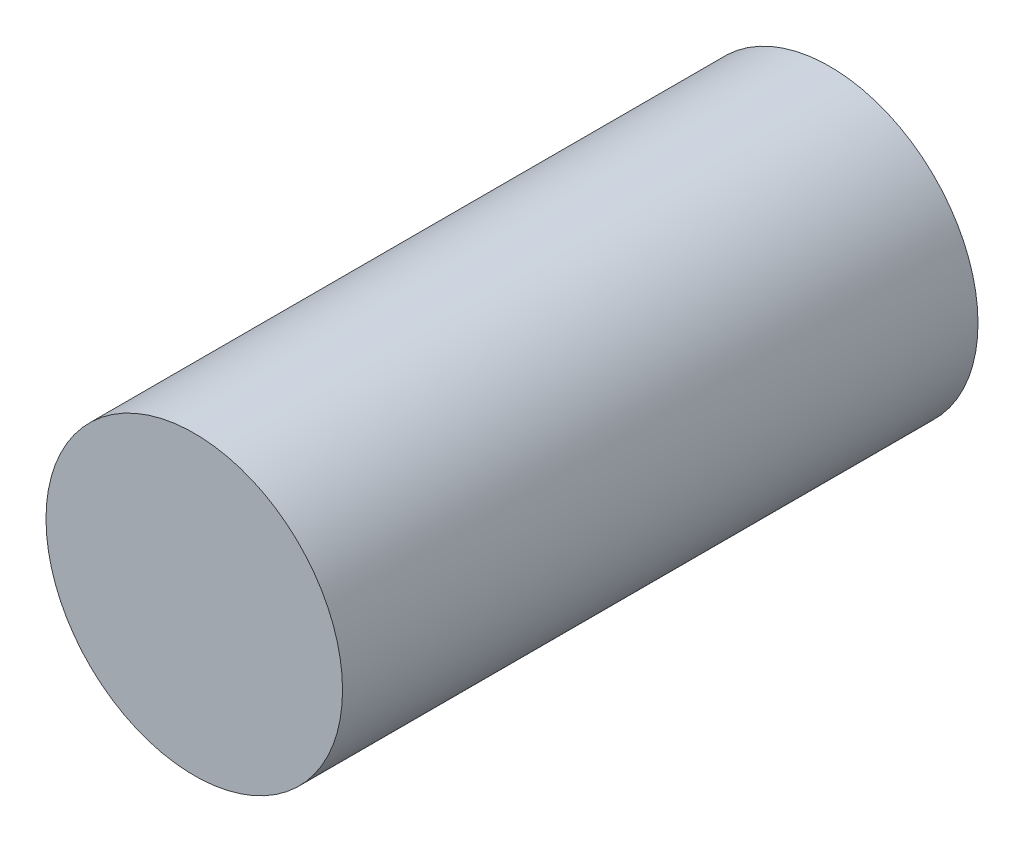
ISO-10303-21;
HEADER;
FILE_DESCRIPTION(('STEP AP214'),'2;1');
FILE_NAME('part.step','',(''),(''),'','','');
FILE_SCHEMA(('AUTOMOTIVE_DESIGN { 1 0 10303 214 1 1 1 1 }'));
ENDSEC;
DATA;
#1=APPLICATION_CONTEXT('core data for automotive mechanical design processes');
#2=APPLICATION_PROTOCOL_DEFINITION('international standard','automotive_design',2000,#1);
#3=PRODUCT_CONTEXT('',#1,'mechanical');
#4=PRODUCT('Part','Part','',(#3));
#5=PRODUCT_RELATED_PRODUCT_CATEGORY('part','',(#4));
#6=PRODUCT_DEFINITION_FORMATION('','',#4);
#7=PRODUCT_DEFINITION_CONTEXT('part definition',#1,'design');
#8=PRODUCT_DEFINITION('design','',#6,#7);
#9=PRODUCT_DEFINITION_SHAPE('','',#8);
#10=(LENGTH_UNIT() NAMED_UNIT(*) SI_UNIT(.MILLI.,.METRE.));
#11=(NAMED_UNIT(*) PLANE_ANGLE_UNIT() SI_UNIT($,.RADIAN.));
#12=(NAMED_UNIT(*) SI_UNIT($,.STERADIAN.) SOLID_ANGLE_UNIT());
#13=UNCERTAINTY_MEASURE_WITH_UNIT(LENGTH_MEASURE(1.E-05),#10,'distance_accuracy_value','');
#14=(GEOMETRIC_REPRESENTATION_CONTEXT(3) GLOBAL_UNCERTAINTY_ASSIGNED_CONTEXT((#13)) GLOBAL_UNIT_ASSIGNED_CONTEXT((#10,
#11,#12)) REPRESENTATION_CONTEXT('',''));
#15=CARTESIAN_POINT('',(0.,0.,0.));
#16=DIRECTION('',(0.,0.,1.));
#17=DIRECTION('',(1.,0.,0.));
#18=AXIS2_PLACEMENT_3D('',#15,#16,#17);
#19=CARTESIAN_POINT('',(0.,0.,30.));
#20=DIRECTION('',(0.,0.,-1.));
#21=DIRECTION('',(-1.,0.,0.));
#22=AXIS2_PLACEMENT_3D('',#19,#20,#21);
#23=CYLINDRICAL_SURFACE('',#22,7.);
#24=CARTESIAN_POINT('',(0.,0.,30.));
#25=DIRECTION('',(0.,0.,1.));
#26=DIRECTION('',(1.,0.,0.));
#27=AXIS2_PLACEMENT_3D('',#24,#25,#26);
#28=CIRCLE('',#27,7.);
#29=CARTESIAN_POINT('',(7.,0.,30.));
#30=VERTEX_POINT('',#29);
#31=EDGE_CURVE('E10',#30,#30,#28,.T.);
#32=ORIENTED_EDGE('',*,*,#31,.F.);
#33=EDGE_LOOP('',(#32));
#34=FACE_BOUND('',#33,.T.);
#35=CARTESIAN_POINT('',(0.,0.,0.));
#36=DIRECTION('',(0.,0.,1.));
#37=DIRECTION('',(1.,0.,0.));
#38=AXIS2_PLACEMENT_3D('',#35,#36,#37);
#39=CIRCLE('',#38,7.);
#40=CARTESIAN_POINT('',(7.,0.,0.));
#41=VERTEX_POINT('',#40);
#42=EDGE_CURVE('E37',#41,#41,#39,.T.);
#43=ORIENTED_EDGE('',*,*,#42,.T.);
#44=EDGE_LOOP('',(#43));
#45=FACE_BOUND('',#44,.T.);
#46=ADVANCED_FACE('F40',(#34,#45),#23,.T.);
#47=CARTESIAN_POINT('',(0.,0.,30.));
#48=DIRECTION('',(0.,0.,1.));
#49=DIRECTION('',(1.,0.,0.));
#50=AXIS2_PLACEMENT_3D('',#47,#48,#49);
#51=PLANE('',#50);
#52=ORIENTED_EDGE('',*,*,#31,.T.);
#53=EDGE_LOOP('',(#52));
#54=FACE_BOUND('',#53,.T.);
#55=ADVANCED_FACE('F55',(#54),#51,.T.);
#56=CARTESIAN_POINT('',(0.,0.,0.));
#57=DIRECTION('',(0.,0.,1.));
#58=DIRECTION('',(1.,0.,0.));
#59=AXIS2_PLACEMENT_3D('',#56,#57,#58);
#60=PLANE('',#59);
#61=ORIENTED_EDGE('',*,*,#42,.F.);
#62=EDGE_LOOP('',(#61));
#63=FACE_BOUND('',#62,.T.);
#64=ADVANCED_FACE('F49',(#63),#60,.F.);
#65=CLOSED_SHELL('',(#46,#55,#64));
#66=MANIFOLD_SOLID_BREP('B2',#65);
#67=ADVANCED_BREP_SHAPE_REPRESENTATION('',(#18,#66),#14);
#68=SHAPE_DEFINITION_REPRESENTATION(#9,#67);
ENDSEC;
END-ISO-10303-21;
